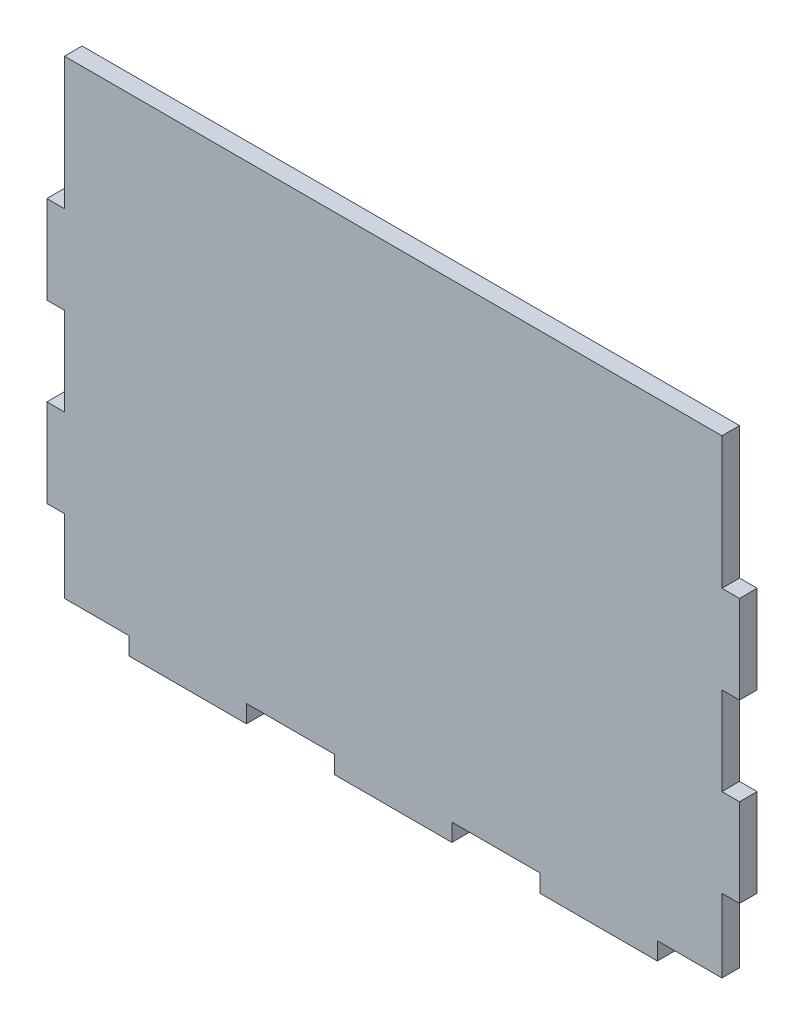
ISO-10303-21;
HEADER;
FILE_DESCRIPTION(('STEP AP214'),'2;1');
FILE_NAME('part.step','',(''),(''),'','','');
FILE_SCHEMA(('AUTOMOTIVE_DESIGN { 1 0 10303 214 1 1 1 1 }'));
ENDSEC;
DATA;
#1=APPLICATION_CONTEXT('core data for automotive mechanical design processes');
#2=APPLICATION_PROTOCOL_DEFINITION('international standard','automotive_design',2000,#1);
#3=PRODUCT_CONTEXT('',#1,'mechanical');
#4=PRODUCT('Part','Part','',(#3));
#5=PRODUCT_RELATED_PRODUCT_CATEGORY('part','',(#4));
#6=PRODUCT_DEFINITION_FORMATION('','',#4);
#7=PRODUCT_DEFINITION_CONTEXT('part definition',#1,'design');
#8=PRODUCT_DEFINITION('design','',#6,#7);
#9=PRODUCT_DEFINITION_SHAPE('','',#8);
#10=(LENGTH_UNIT() NAMED_UNIT(*) SI_UNIT(.MILLI.,.METRE.));
#11=(NAMED_UNIT(*) PLANE_ANGLE_UNIT() SI_UNIT($,.RADIAN.));
#12=(NAMED_UNIT(*) SI_UNIT($,.STERADIAN.) SOLID_ANGLE_UNIT());
#13=UNCERTAINTY_MEASURE_WITH_UNIT(LENGTH_MEASURE(1.E-05),#10,'distance_accuracy_value','');
#14=(GEOMETRIC_REPRESENTATION_CONTEXT(3) GLOBAL_UNCERTAINTY_ASSIGNED_CONTEXT((#13)) GLOBAL_UNIT_ASSIGNED_CONTEXT((#10,
#11,#12)) REPRESENTATION_CONTEXT('',''));
#15=CARTESIAN_POINT('',(0.,0.,0.));
#16=DIRECTION('',(0.,0.,1.));
#17=DIRECTION('',(1.,0.,0.));
#18=AXIS2_PLACEMENT_3D('',#15,#16,#17);
#19=CARTESIAN_POINT('',(-56.,0.,3.));
#20=DIRECTION('',(-1.,0.,0.));
#21=DIRECTION('',(0.,-1.,0.));
#22=AXIS2_PLACEMENT_3D('',#19,#20,#21);
#23=PLANE('',#22);
#24=DIRECTION('',(0.,0.,-1.));
#25=VECTOR('',#24,1.);
#26=CARTESIAN_POINT('',(-56.,-12.5,3.));
#27=LINE('',#26,#25);
#28=CARTESIAN_POINT('',(-56.,-12.5,3.));
#29=VERTEX_POINT('',#28);
#30=CARTESIAN_POINT('',(-56.,-12.5,0.));
#31=VERTEX_POINT('',#30);
#32=EDGE_CURVE('E12',#29,#31,#27,.T.);
#33=ORIENTED_EDGE('',*,*,#32,.F.);
#34=DIRECTION('',(0.,1.,0.));
#35=VECTOR('',#34,1.);
#36=CARTESIAN_POINT('',(-56.,0.,3.));
#37=LINE('',#36,#35);
#38=CARTESIAN_POINT('',(-56.,2.49999999999998,3.));
#39=VERTEX_POINT('',#38);
#40=EDGE_CURVE('E576',#29,#39,#37,.T.);
#41=ORIENTED_EDGE('',*,*,#40,.T.);
#42=DIRECTION('',(0.,0.,-1.));
#43=VECTOR('',#42,1.);
#44=CARTESIAN_POINT('',(-56.,2.49999999999998,3.));
#45=LINE('',#44,#43);
#46=CARTESIAN_POINT('',(-56.,2.49999999999998,0.));
#47=VERTEX_POINT('',#46);
#48=EDGE_CURVE('E636',#39,#47,#45,.T.);
#49=ORIENTED_EDGE('',*,*,#48,.T.);
#50=DIRECTION('',(0.,1.,0.));
#51=VECTOR('',#50,1.);
#52=CARTESIAN_POINT('',(-56.,0.,0.));
#53=LINE('',#52,#51);
#54=EDGE_CURVE('E529',#31,#47,#53,.T.);
#55=ORIENTED_EDGE('',*,*,#54,.F.);
#56=EDGE_LOOP('',(#33,#41,#49,#55));
#57=FACE_BOUND('',#56,.T.);
#58=ADVANCED_FACE('F323',(#57),#23,.T.);
#59=CARTESIAN_POINT('',(0.,0.,0.));
#60=DIRECTION('',(0.,0.,1.));
#61=DIRECTION('',(1.,0.,0.));
#62=AXIS2_PLACEMENT_3D('',#59,#60,#61);
#63=PLANE('',#62);
#64=DIRECTION('',(-1.,0.,0.));
#65=VECTOR('',#64,1.);
#66=CARTESIAN_POINT('',(0.,-40.,0.));
#67=LINE('',#66,#65);
#68=CARTESIAN_POINT('',(56.,-40.,0.));
#69=VERTEX_POINT('',#68);
#70=CARTESIAN_POINT('',(45.,-40.,0.));
#71=VERTEX_POINT('',#70);
#72=EDGE_CURVE('E534',#69,#71,#67,.T.);
#73=ORIENTED_EDGE('',*,*,#72,.T.);
#74=DIRECTION('',(0.,1.,0.));
#75=VECTOR('',#74,1.);
#76=CARTESIAN_POINT('',(45.,0.,0.));
#77=LINE('',#76,#75);
#78=CARTESIAN_POINT('',(45.,-43.,0.));
#79=VERTEX_POINT('',#78);
#80=EDGE_CURVE('E568',#79,#71,#77,.T.);
#81=ORIENTED_EDGE('',*,*,#80,.F.);
#82=DIRECTION('',(1.,0.,0.));
#83=VECTOR('',#82,1.);
#84=CARTESIAN_POINT('',(0.,-43.,0.));
#85=LINE('',#84,#83);
#86=CARTESIAN_POINT('',(25.,-43.,0.));
#87=VERTEX_POINT('',#86);
#88=EDGE_CURVE('E564',#87,#79,#85,.T.);
#89=ORIENTED_EDGE('',*,*,#88,.F.);
#90=DIRECTION('',(0.,1.,0.));
#91=VECTOR('',#90,1.);
#92=CARTESIAN_POINT('',(25.,0.,0.));
#93=LINE('',#92,#91);
#94=CARTESIAN_POINT('',(25.,-40.,0.));
#95=VERTEX_POINT('',#94);
#96=EDGE_CURVE('E560',#87,#95,#93,.T.);
#97=ORIENTED_EDGE('',*,*,#96,.T.);
#98=CARTESIAN_POINT('',(9.99999999999999,-40.,0.));
#99=VERTEX_POINT('',#98);
#100=EDGE_CURVE('E559',#95,#99,#67,.T.);
#101=ORIENTED_EDGE('',*,*,#100,.T.);
#102=DIRECTION('',(0.,1.,0.));
#103=VECTOR('',#102,1.);
#104=CARTESIAN_POINT('',(9.99999999999981,0.,0.));
#105=LINE('',#104,#103);
#106=CARTESIAN_POINT('',(10.,-43.,0.));
#107=VERTEX_POINT('',#106);
#108=EDGE_CURVE('E555',#107,#99,#105,.T.);
#109=ORIENTED_EDGE('',*,*,#108,.F.);
#110=DIRECTION('',(1.,0.,0.));
#111=VECTOR('',#110,1.);
#112=CARTESIAN_POINT('',(0.,-43.,0.));
#113=LINE('',#112,#111);
#114=CARTESIAN_POINT('',(-9.99999999999999,-43.,0.));
#115=VERTEX_POINT('',#114);
#116=EDGE_CURVE('E551',#115,#107,#113,.T.);
#117=ORIENTED_EDGE('',*,*,#116,.F.);
#118=DIRECTION('',(0.,1.,0.));
#119=VECTOR('',#118,1.);
#120=CARTESIAN_POINT('',(-9.99999999999999,0.,0.));
#121=LINE('',#120,#119);
#122=CARTESIAN_POINT('',(-9.99999999999999,-40.,0.));
#123=VERTEX_POINT('',#122);
#124=EDGE_CURVE('E547',#115,#123,#121,.T.);
#125=ORIENTED_EDGE('',*,*,#124,.T.);
#126=CARTESIAN_POINT('',(-25.,-40.,0.));
#127=VERTEX_POINT('',#126);
#128=EDGE_CURVE('E535',#123,#127,#67,.T.);
#129=ORIENTED_EDGE('',*,*,#128,.T.);
#130=DIRECTION('',(0.,1.,0.));
#131=VECTOR('',#130,1.);
#132=CARTESIAN_POINT('',(-25.,0.,0.));
#133=LINE('',#132,#131);
#134=CARTESIAN_POINT('',(-25.,-43.,0.));
#135=VERTEX_POINT('',#134);
#136=EDGE_CURVE('E543',#135,#127,#133,.T.);
#137=ORIENTED_EDGE('',*,*,#136,.F.);
#138=DIRECTION('',(-1.,0.,0.));
#139=VECTOR('',#138,1.);
#140=CARTESIAN_POINT('',(0.,-43.,0.));
#141=LINE('',#140,#139);
#142=CARTESIAN_POINT('',(-45.,-43.,0.));
#143=VERTEX_POINT('',#142);
#144=EDGE_CURVE('E539',#135,#143,#141,.T.);
#145=ORIENTED_EDGE('',*,*,#144,.T.);
#146=DIRECTION('',(0.,1.,0.));
#147=VECTOR('',#146,1.);
#148=CARTESIAN_POINT('',(-45.,0.,0.));
#149=LINE('',#148,#147);
#150=CARTESIAN_POINT('',(-45.,-40.,0.));
#151=VERTEX_POINT('',#150);
#152=EDGE_CURVE('E533',#143,#151,#149,.T.);
#153=ORIENTED_EDGE('',*,*,#152,.T.);
#154=CARTESIAN_POINT('',(-56.,-40.,0.));
#155=VERTEX_POINT('',#154);
#156=EDGE_CURVE('E528',#151,#155,#67,.T.);
#157=ORIENTED_EDGE('',*,*,#156,.T.);
#158=CARTESIAN_POINT('',(-56.,-27.5,0.));
#159=VERTEX_POINT('',#158);
#160=EDGE_CURVE('E524',#155,#159,#53,.T.);
#161=ORIENTED_EDGE('',*,*,#160,.T.);
#162=DIRECTION('',(1.,0.,0.));
#163=VECTOR('',#162,1.);
#164=CARTESIAN_POINT('',(-59.,-27.5,0.));
#165=LINE('',#164,#163);
#166=CARTESIAN_POINT('',(-59.,-27.5,0.));
#167=VERTEX_POINT('',#166);
#168=EDGE_CURVE('E678',#167,#159,#165,.T.);
#169=ORIENTED_EDGE('',*,*,#168,.F.);
#170=DIRECTION('',(0.,1.,0.));
#171=VECTOR('',#170,1.);
#172=CARTESIAN_POINT('',(-59.,-27.5,0.));
#173=LINE('',#172,#171);
#174=CARTESIAN_POINT('',(-59.,-12.5,0.));
#175=VERTEX_POINT('',#174);
#176=EDGE_CURVE('E483',#167,#175,#173,.T.);
#177=ORIENTED_EDGE('',*,*,#176,.T.);
#178=DIRECTION('',(1.,0.,0.));
#179=VECTOR('',#178,1.);
#180=CARTESIAN_POINT('',(-59.,-12.5,0.));
#181=LINE('',#180,#179);
#182=EDGE_CURVE('E690',#175,#31,#181,.T.);
#183=ORIENTED_EDGE('',*,*,#182,.T.);
#184=ORIENTED_EDGE('',*,*,#54,.T.);
#185=DIRECTION('',(1.,0.,0.));
#186=VECTOR('',#185,1.);
#187=CARTESIAN_POINT('',(-59.,2.5,0.));
#188=LINE('',#187,#186);
#189=CARTESIAN_POINT('',(-59.,2.5,0.));
#190=VERTEX_POINT('',#189);
#191=EDGE_CURVE('E465',#190,#47,#188,.T.);
#192=ORIENTED_EDGE('',*,*,#191,.F.);
#193=DIRECTION('',(0.,1.,0.));
#194=VECTOR('',#193,1.);
#195=CARTESIAN_POINT('',(-59.,2.5,0.));
#196=LINE('',#195,#194);
#197=CARTESIAN_POINT('',(-59.,17.5,0.));
#198=VERTEX_POINT('',#197);
#199=EDGE_CURVE('E456',#190,#198,#196,.T.);
#200=ORIENTED_EDGE('',*,*,#199,.T.);
#201=DIRECTION('',(1.,0.,0.));
#202=VECTOR('',#201,1.);
#203=CARTESIAN_POINT('',(-59.,17.5,0.));
#204=LINE('',#203,#202);
#205=CARTESIAN_POINT('',(-56.,17.5,0.));
#206=VERTEX_POINT('',#205);
#207=EDGE_CURVE('E459',#198,#206,#204,.T.);
#208=ORIENTED_EDGE('',*,*,#207,.T.);
#209=DIRECTION('',(0.,1.,0.));
#210=VECTOR('',#209,1.);
#211=CARTESIAN_POINT('',(-56.,-40.,0.));
#212=LINE('',#211,#210);
#213=CARTESIAN_POINT('',(-56.,40.,0.));
#214=VERTEX_POINT('',#213);
#215=EDGE_CURVE('E718',#206,#214,#212,.T.);
#216=ORIENTED_EDGE('',*,*,#215,.T.);
#217=DIRECTION('',(-1.,0.,0.));
#218=VECTOR('',#217,1.);
#219=CARTESIAN_POINT('',(56.,40.,0.));
#220=LINE('',#219,#218);
#221=CARTESIAN_POINT('',(56.,40.,0.));
#222=VERTEX_POINT('',#221);
#223=EDGE_CURVE('E478',#222,#214,#220,.T.);
#224=ORIENTED_EDGE('',*,*,#223,.F.);
#225=DIRECTION('',(0.,1.,0.));
#226=VECTOR('',#225,1.);
#227=CARTESIAN_POINT('',(56.,-40.,0.));
#228=LINE('',#227,#226);
#229=CARTESIAN_POINT('',(56.,17.5,0.));
#230=VERTEX_POINT('',#229);
#231=EDGE_CURVE('E448',#230,#222,#228,.T.);
#232=ORIENTED_EDGE('',*,*,#231,.F.);
#233=DIRECTION('',(-1.,0.,0.));
#234=VECTOR('',#233,1.);
#235=CARTESIAN_POINT('',(59.,17.5,0.));
#236=LINE('',#235,#234);
#237=CARTESIAN_POINT('',(59.,17.5,0.));
#238=VERTEX_POINT('',#237);
#239=EDGE_CURVE('E439',#238,#230,#236,.T.);
#240=ORIENTED_EDGE('',*,*,#239,.F.);
#241=DIRECTION('',(0.,1.,0.));
#242=VECTOR('',#241,1.);
#243=CARTESIAN_POINT('',(59.,2.5,0.));
#244=LINE('',#243,#242);
#245=CARTESIAN_POINT('',(59.,2.5,0.));
#246=VERTEX_POINT('',#245);
#247=EDGE_CURVE('E424',#246,#238,#244,.T.);
#248=ORIENTED_EDGE('',*,*,#247,.F.);
#249=DIRECTION('',(-1.,0.,0.));
#250=VECTOR('',#249,1.);
#251=CARTESIAN_POINT('',(59.,2.5,0.));
#252=LINE('',#251,#250);
#253=CARTESIAN_POINT('',(56.,2.49999999999999,0.));
#254=VERTEX_POINT('',#253);
#255=EDGE_CURVE('E435',#246,#254,#252,.T.);
#256=ORIENTED_EDGE('',*,*,#255,.T.);
#257=DIRECTION('',(0.,1.,0.));
#258=VECTOR('',#257,1.);
#259=CARTESIAN_POINT('',(56.,0.,0.));
#260=LINE('',#259,#258);
#261=CARTESIAN_POINT('',(56.,-12.5,0.));
#262=VERTEX_POINT('',#261);
#263=EDGE_CURVE('E577',#262,#254,#260,.T.);
#264=ORIENTED_EDGE('',*,*,#263,.F.);
#265=DIRECTION('',(-1.,0.,0.));
#266=VECTOR('',#265,1.);
#267=CARTESIAN_POINT('',(59.,-12.5,0.));
#268=LINE('',#267,#266);
#269=CARTESIAN_POINT('',(59.,-12.5,0.));
#270=VERTEX_POINT('',#269);
#271=EDGE_CURVE('E655',#270,#262,#268,.T.);
#272=ORIENTED_EDGE('',*,*,#271,.F.);
#273=DIRECTION('',(0.,1.,0.));
#274=VECTOR('',#273,1.);
#275=CARTESIAN_POINT('',(59.,-27.5,0.));
#276=LINE('',#275,#274);
#277=CARTESIAN_POINT('',(59.,-27.5,0.));
#278=VERTEX_POINT('',#277);
#279=EDGE_CURVE('E644',#278,#270,#276,.T.);
#280=ORIENTED_EDGE('',*,*,#279,.F.);
#281=DIRECTION('',(-1.,0.,0.));
#282=VECTOR('',#281,1.);
#283=CARTESIAN_POINT('',(59.,-27.5,0.));
#284=LINE('',#283,#282);
#285=CARTESIAN_POINT('',(56.,-27.5,0.));
#286=VERTEX_POINT('',#285);
#287=EDGE_CURVE('E651',#278,#286,#284,.T.);
#288=ORIENTED_EDGE('',*,*,#287,.T.);
#289=EDGE_CURVE('E572',#69,#286,#260,.T.);
#290=ORIENTED_EDGE('',*,*,#289,.F.);
#291=EDGE_LOOP('',(#73,#81,#89,#97,#101,#109,#117,#125,#129,#137,#145,#153,#157,#161,#169,#177,
#183,#184,#192,#200,#208,#216,#224,#232,#240,#248,#256,#264,#272,#280,#288,#290));
#292=FACE_BOUND('',#291,.T.);
#293=ADVANCED_FACE('F446',(#292),#63,.F.);
#294=CARTESIAN_POINT('',(0.,-40.,3.));
#295=DIRECTION('',(0.,-1.,0.));
#296=DIRECTION('',(0.,0.,-1.));
#297=AXIS2_PLACEMENT_3D('',#294,#295,#296);
#298=PLANE('',#297);
#299=ORIENTED_EDGE('',*,*,#156,.F.);
#300=DIRECTION('',(0.,0.,-1.));
#301=VECTOR('',#300,1.);
#302=CARTESIAN_POINT('',(-45.,-40.,3.));
#303=LINE('',#302,#301);
#304=CARTESIAN_POINT('',(-45.,-40.,3.));
#305=VERTEX_POINT('',#304);
#306=EDGE_CURVE('E628',#305,#151,#303,.T.);
#307=ORIENTED_EDGE('',*,*,#306,.F.);
#308=DIRECTION('',(-1.,0.,0.));
#309=VECTOR('',#308,1.);
#310=CARTESIAN_POINT('',(0.,-40.,3.));
#311=LINE('',#310,#309);
#312=CARTESIAN_POINT('',(-56.,-40.,3.));
#313=VERTEX_POINT('',#312);
#314=EDGE_CURVE('E520',#305,#313,#311,.T.);
#315=ORIENTED_EDGE('',*,*,#314,.T.);
#316=DIRECTION('',(0.,0.,-1.));
#317=VECTOR('',#316,1.);
#318=CARTESIAN_POINT('',(-56.,-40.,3.));
#319=LINE('',#318,#317);
#320=EDGE_CURVE('E632',#313,#155,#319,.T.);
#321=ORIENTED_EDGE('',*,*,#320,.T.);
#322=EDGE_LOOP('',(#299,#307,#315,#321));
#323=FACE_BOUND('',#322,.T.);
#324=ADVANCED_FACE('F840',(#323),#298,.T.);
#325=ORIENTED_EDGE('',*,*,#128,.F.);
#326=DIRECTION('',(0.,0.,-1.));
#327=VECTOR('',#326,1.);
#328=CARTESIAN_POINT('',(-9.99999999999999,-40.,3.));
#329=LINE('',#328,#327);
#330=CARTESIAN_POINT('',(-9.99999999999999,-40.,3.));
#331=VERTEX_POINT('',#330);
#332=EDGE_CURVE('E612',#331,#123,#329,.T.);
#333=ORIENTED_EDGE('',*,*,#332,.F.);
#334=CARTESIAN_POINT('',(-25.,-40.,3.));
#335=VERTEX_POINT('',#334);
#336=EDGE_CURVE('E763',#331,#335,#311,.T.);
#337=ORIENTED_EDGE('',*,*,#336,.T.);
#338=DIRECTION('',(0.,0.,-1.));
#339=VECTOR('',#338,1.);
#340=CARTESIAN_POINT('',(-25.,-40.,3.));
#341=LINE('',#340,#339);
#342=EDGE_CURVE('E616',#335,#127,#341,.T.);
#343=ORIENTED_EDGE('',*,*,#342,.T.);
#344=EDGE_LOOP('',(#325,#333,#337,#343));
#345=FACE_BOUND('',#344,.T.);
#346=ADVANCED_FACE('F846',(#345),#298,.T.);
#347=ORIENTED_EDGE('',*,*,#100,.F.);
#348=DIRECTION('',(0.,0.,-1.));
#349=VECTOR('',#348,1.);
#350=CARTESIAN_POINT('',(25.,-40.,3.));
#351=LINE('',#350,#349);
#352=CARTESIAN_POINT('',(25.,-40.,3.));
#353=VERTEX_POINT('',#352);
#354=EDGE_CURVE('E596',#353,#95,#351,.T.);
#355=ORIENTED_EDGE('',*,*,#354,.F.);
#356=CARTESIAN_POINT('',(9.99999999999999,-40.,3.));
#357=VERTEX_POINT('',#356);
#358=EDGE_CURVE('E519',#353,#357,#311,.T.);
#359=ORIENTED_EDGE('',*,*,#358,.T.);
#360=DIRECTION('',(0.,0.,-1.));
#361=VECTOR('',#360,1.);
#362=CARTESIAN_POINT('',(9.99999999999999,-40.,3.));
#363=LINE('',#362,#361);
#364=EDGE_CURVE('E600',#357,#99,#363,.T.);
#365=ORIENTED_EDGE('',*,*,#364,.T.);
#366=EDGE_LOOP('',(#347,#355,#359,#365));
#367=FACE_BOUND('',#366,.T.);
#368=ADVANCED_FACE('F859',(#367),#298,.T.);
#369=ORIENTED_EDGE('',*,*,#72,.F.);
#370=DIRECTION('',(0.,0.,-1.));
#371=VECTOR('',#370,1.);
#372=CARTESIAN_POINT('',(56.,-40.,3.));
#373=LINE('',#372,#371);
#374=CARTESIAN_POINT('',(56.,-40.,3.));
#375=VERTEX_POINT('',#374);
#376=EDGE_CURVE('E580',#375,#69,#373,.T.);
#377=ORIENTED_EDGE('',*,*,#376,.F.);
#378=CARTESIAN_POINT('',(45.,-40.,3.));
#379=VERTEX_POINT('',#378);
#380=EDGE_CURVE('E510',#375,#379,#311,.T.);
#381=ORIENTED_EDGE('',*,*,#380,.T.);
#382=DIRECTION('',(0.,0.,-1.));
#383=VECTOR('',#382,1.);
#384=CARTESIAN_POINT('',(45.,-40.,3.));
#385=LINE('',#384,#383);
#386=EDGE_CURVE('E584',#379,#71,#385,.T.);
#387=ORIENTED_EDGE('',*,*,#386,.T.);
#388=EDGE_LOOP('',(#369,#377,#381,#387));
#389=FACE_BOUND('',#388,.T.);
#390=ADVANCED_FACE('F808',(#389),#298,.T.);
#391=CARTESIAN_POINT('',(56.,0.,3.));
#392=DIRECTION('',(-1.,0.,0.));
#393=DIRECTION('',(0.,-1.,0.));
#394=AXIS2_PLACEMENT_3D('',#391,#392,#393);
#395=PLANE('',#394);
#396=DIRECTION('',(0.,1.,0.));
#397=VECTOR('',#396,1.);
#398=CARTESIAN_POINT('',(56.,0.,3.));
#399=LINE('',#398,#397);
#400=CARTESIAN_POINT('',(56.,-12.5,3.));
#401=VERTEX_POINT('',#400);
#402=CARTESIAN_POINT('',(56.,2.49999999999999,3.));
#403=VERTEX_POINT('',#402);
#404=EDGE_CURVE('E501',#401,#403,#399,.T.);
#405=ORIENTED_EDGE('',*,*,#404,.F.);
#406=DIRECTION('',(0.,0.,-1.));
#407=VECTOR('',#406,1.);
#408=CARTESIAN_POINT('',(56.,-12.5,3.));
#409=LINE('',#408,#407);
#410=EDGE_CURVE('E343',#401,#262,#409,.T.);
#411=ORIENTED_EDGE('',*,*,#410,.T.);
#412=ORIENTED_EDGE('',*,*,#263,.T.);
#413=DIRECTION('',(0.,0.,-1.));
#414=VECTOR('',#413,1.);
#415=CARTESIAN_POINT('',(56.,2.49999999999999,3.));
#416=LINE('',#415,#414);
#417=EDGE_CURVE('E515',#403,#254,#416,.T.);
#418=ORIENTED_EDGE('',*,*,#417,.F.);
#419=EDGE_LOOP('',(#405,#411,#412,#418));
#420=FACE_BOUND('',#419,.T.);
#421=ADVANCED_FACE('F836',(#420),#395,.F.);
#422=CARTESIAN_POINT('',(-56.,-27.5,3.));
#423=VERTEX_POINT('',#422);
#424=EDGE_CURVE('E755',#313,#423,#37,.T.);
#425=ORIENTED_EDGE('',*,*,#424,.T.);
#426=DIRECTION('',(0.,0.,-1.));
#427=VECTOR('',#426,1.);
#428=CARTESIAN_POINT('',(-56.,-27.5,3.));
#429=LINE('',#428,#427);
#430=EDGE_CURVE('E334',#423,#159,#429,.T.);
#431=ORIENTED_EDGE('',*,*,#430,.T.);
#432=ORIENTED_EDGE('',*,*,#160,.F.);
#433=ORIENTED_EDGE('',*,*,#320,.F.);
#434=EDGE_LOOP('',(#425,#431,#432,#433));
#435=FACE_BOUND('',#434,.T.);
#436=ADVANCED_FACE('F852',(#435),#23,.T.);
#437=DIRECTION('',(0.,0.,-1.));
#438=VECTOR('',#437,1.);
#439=CARTESIAN_POINT('',(56.,-27.5,3.));
#440=LINE('',#439,#438);
#441=CARTESIAN_POINT('',(56.,-27.5,3.));
#442=VERTEX_POINT('',#441);
#443=EDGE_CURVE('E669',#442,#286,#440,.T.);
#444=ORIENTED_EDGE('',*,*,#443,.F.);
#445=EDGE_CURVE('E509',#375,#442,#399,.T.);
#446=ORIENTED_EDGE('',*,*,#445,.F.);
#447=ORIENTED_EDGE('',*,*,#376,.T.);
#448=ORIENTED_EDGE('',*,*,#289,.T.);
#449=EDGE_LOOP('',(#444,#446,#447,#448));
#450=FACE_BOUND('',#449,.T.);
#451=ADVANCED_FACE('F815',(#450),#395,.F.);
#452=CARTESIAN_POINT('',(0.,0.,3.));
#453=DIRECTION('',(0.,0.,1.));
#454=DIRECTION('',(1.,0.,0.));
#455=AXIS2_PLACEMENT_3D('',#452,#453,#454);
#456=PLANE('',#455);
#457=ORIENTED_EDGE('',*,*,#358,.F.);
#458=DIRECTION('',(0.,1.,0.));
#459=VECTOR('',#458,1.);
#460=CARTESIAN_POINT('',(25.,0.,3.));
#461=LINE('',#460,#459);
#462=CARTESIAN_POINT('',(25.,-43.,3.));
#463=VERTEX_POINT('',#462);
#464=EDGE_CURVE('E787',#463,#353,#461,.T.);
#465=ORIENTED_EDGE('',*,*,#464,.F.);
#466=DIRECTION('',(1.,0.,0.));
#467=VECTOR('',#466,1.);
#468=CARTESIAN_POINT('',(0.,-43.,3.));
#469=LINE('',#468,#467);
#470=CARTESIAN_POINT('',(45.,-43.,3.));
#471=VERTEX_POINT('',#470);
#472=EDGE_CURVE('E790',#463,#471,#469,.T.);
#473=ORIENTED_EDGE('',*,*,#472,.T.);
#474=DIRECTION('',(0.,1.,0.));
#475=VECTOR('',#474,1.);
#476=CARTESIAN_POINT('',(45.,0.,3.));
#477=LINE('',#476,#475);
#478=EDGE_CURVE('E517',#471,#379,#477,.T.);
#479=ORIENTED_EDGE('',*,*,#478,.T.);
#480=ORIENTED_EDGE('',*,*,#380,.F.);
#481=ORIENTED_EDGE('',*,*,#445,.T.);
#482=DIRECTION('',(-1.,0.,0.));
#483=VECTOR('',#482,1.);
#484=CARTESIAN_POINT('',(59.,-27.5,3.));
#485=LINE('',#484,#483);
#486=CARTESIAN_POINT('',(59.,-27.5,3.));
#487=VERTEX_POINT('',#486);
#488=EDGE_CURVE('E640',#487,#442,#485,.T.);
#489=ORIENTED_EDGE('',*,*,#488,.F.);
#490=DIRECTION('',(0.,1.,0.));
#491=VECTOR('',#490,1.);
#492=CARTESIAN_POINT('',(59.,-27.5,3.));
#493=LINE('',#492,#491);
#494=CARTESIAN_POINT('',(59.,-12.5,3.));
#495=VERTEX_POINT('',#494);
#496=EDGE_CURVE('E647',#487,#495,#493,.T.);
#497=ORIENTED_EDGE('',*,*,#496,.T.);
#498=DIRECTION('',(-1.,0.,0.));
#499=VECTOR('',#498,1.);
#500=CARTESIAN_POINT('',(59.,-12.5,3.));
#501=LINE('',#500,#499);
#502=EDGE_CURVE('E502',#495,#401,#501,.T.);
#503=ORIENTED_EDGE('',*,*,#502,.T.);
#504=ORIENTED_EDGE('',*,*,#404,.T.);
#505=DIRECTION('',(-1.,0.,0.));
#506=VECTOR('',#505,1.);
#507=CARTESIAN_POINT('',(59.,2.5,3.));
#508=LINE('',#507,#506);
#509=CARTESIAN_POINT('',(59.,2.5,3.));
#510=VERTEX_POINT('',#509);
#511=EDGE_CURVE('E487',#510,#403,#508,.T.);
#512=ORIENTED_EDGE('',*,*,#511,.F.);
#513=DIRECTION('',(0.,1.,0.));
#514=VECTOR('',#513,1.);
#515=CARTESIAN_POINT('',(59.,2.5,3.));
#516=LINE('',#515,#514);
#517=CARTESIAN_POINT('',(59.,17.5,3.));
#518=VERTEX_POINT('',#517);
#519=EDGE_CURVE('E443',#510,#518,#516,.T.);
#520=ORIENTED_EDGE('',*,*,#519,.T.);
#521=DIRECTION('',(-1.,0.,0.));
#522=VECTOR('',#521,1.);
#523=CARTESIAN_POINT('',(59.,17.5,3.));
#524=LINE('',#523,#522);
#525=CARTESIAN_POINT('',(56.,17.5,3.));
#526=VERTEX_POINT('',#525);
#527=EDGE_CURVE('E434',#518,#526,#524,.T.);
#528=ORIENTED_EDGE('',*,*,#527,.T.);
#529=DIRECTION('',(0.,1.,0.));
#530=VECTOR('',#529,1.);
#531=CARTESIAN_POINT('',(56.,-40.,3.));
#532=LINE('',#531,#530);
#533=CARTESIAN_POINT('',(56.,40.,3.));
#534=VERTEX_POINT('',#533);
#535=EDGE_CURVE('E711',#526,#534,#532,.T.);
#536=ORIENTED_EDGE('',*,*,#535,.T.);
#537=DIRECTION('',(-1.,0.,0.));
#538=VECTOR('',#537,1.);
#539=CARTESIAN_POINT('',(56.,40.,3.));
#540=LINE('',#539,#538);
#541=CARTESIAN_POINT('',(-56.,40.,3.));
#542=VERTEX_POINT('',#541);
#543=EDGE_CURVE('E704',#534,#542,#540,.T.);
#544=ORIENTED_EDGE('',*,*,#543,.T.);
#545=DIRECTION('',(0.,1.,0.));
#546=VECTOR('',#545,1.);
#547=CARTESIAN_POINT('',(-56.,-40.,3.));
#548=LINE('',#547,#546);
#549=CARTESIAN_POINT('',(-56.,17.5,3.));
#550=VERTEX_POINT('',#549);
#551=EDGE_CURVE('E708',#550,#542,#548,.T.);
#552=ORIENTED_EDGE('',*,*,#551,.F.);
#553=DIRECTION('',(1.,0.,0.));
#554=VECTOR('',#553,1.);
#555=CARTESIAN_POINT('',(-59.,17.5,3.));
#556=LINE('',#555,#554);
#557=CARTESIAN_POINT('',(-59.,17.5,3.));
#558=VERTEX_POINT('',#557);
#559=EDGE_CURVE('E732',#558,#550,#556,.T.);
#560=ORIENTED_EDGE('',*,*,#559,.F.);
#561=DIRECTION('',(0.,1.,0.));
#562=VECTOR('',#561,1.);
#563=CARTESIAN_POINT('',(-59.,2.5,3.));
#564=LINE('',#563,#562);
#565=CARTESIAN_POINT('',(-59.,2.5,3.));
#566=VERTEX_POINT('',#565);
#567=EDGE_CURVE('E474',#566,#558,#564,.T.);
#568=ORIENTED_EDGE('',*,*,#567,.F.);
#569=DIRECTION('',(1.,0.,0.));
#570=VECTOR('',#569,1.);
#571=CARTESIAN_POINT('',(-59.,2.5,3.));
#572=LINE('',#571,#570);
#573=EDGE_CURVE('E468',#566,#39,#572,.T.);
#574=ORIENTED_EDGE('',*,*,#573,.T.);
#575=ORIENTED_EDGE('',*,*,#40,.F.);
#576=DIRECTION('',(1.,0.,0.));
#577=VECTOR('',#576,1.);
#578=CARTESIAN_POINT('',(-59.,-12.5,3.));
#579=LINE('',#578,#577);
#580=CARTESIAN_POINT('',(-59.,-12.5,3.));
#581=VERTEX_POINT('',#580);
#582=EDGE_CURVE('E677',#581,#29,#579,.T.);
#583=ORIENTED_EDGE('',*,*,#582,.F.);
#584=DIRECTION('',(0.,1.,0.));
#585=VECTOR('',#584,1.);
#586=CARTESIAN_POINT('',(-59.,-27.5,3.));
#587=LINE('',#586,#585);
#588=CARTESIAN_POINT('',(-59.,-27.5,3.));
#589=VERTEX_POINT('',#588);
#590=EDGE_CURVE('E673',#589,#581,#587,.T.);
#591=ORIENTED_EDGE('',*,*,#590,.F.);
#592=DIRECTION('',(1.,0.,0.));
#593=VECTOR('',#592,1.);
#594=CARTESIAN_POINT('',(-59.,-27.5,3.));
#595=LINE('',#594,#593);
#596=EDGE_CURVE('E682',#589,#423,#595,.T.);
#597=ORIENTED_EDGE('',*,*,#596,.T.);
#598=ORIENTED_EDGE('',*,*,#424,.F.);
#599=ORIENTED_EDGE('',*,*,#314,.F.);
#600=DIRECTION('',(0.,1.,0.));
#601=VECTOR('',#600,1.);
#602=CARTESIAN_POINT('',(-45.,0.,3.));
#603=LINE('',#602,#601);
#604=CARTESIAN_POINT('',(-45.,-43.,3.));
#605=VERTEX_POINT('',#604);
#606=EDGE_CURVE('E762',#605,#305,#603,.T.);
#607=ORIENTED_EDGE('',*,*,#606,.F.);
#608=DIRECTION('',(-1.,0.,0.));
#609=VECTOR('',#608,1.);
#610=CARTESIAN_POINT('',(0.,-43.,3.));
#611=LINE('',#610,#609);
#612=CARTESIAN_POINT('',(-25.,-43.,3.));
#613=VERTEX_POINT('',#612);
#614=EDGE_CURVE('E767',#613,#605,#611,.T.);
#615=ORIENTED_EDGE('',*,*,#614,.F.);
#616=DIRECTION('',(0.,1.,0.));
#617=VECTOR('',#616,1.);
#618=CARTESIAN_POINT('',(-25.,0.,3.));
#619=LINE('',#618,#617);
#620=EDGE_CURVE('E771',#613,#335,#619,.T.);
#621=ORIENTED_EDGE('',*,*,#620,.T.);
#622=ORIENTED_EDGE('',*,*,#336,.F.);
#623=DIRECTION('',(0.,1.,0.));
#624=VECTOR('',#623,1.);
#625=CARTESIAN_POINT('',(-9.99999999999999,0.,3.));
#626=LINE('',#625,#624);
#627=CARTESIAN_POINT('',(-9.99999999999999,-43.,3.));
#628=VERTEX_POINT('',#627);
#629=EDGE_CURVE('E775',#628,#331,#626,.T.);
#630=ORIENTED_EDGE('',*,*,#629,.F.);
#631=DIRECTION('',(1.,0.,0.));
#632=VECTOR('',#631,1.);
#633=CARTESIAN_POINT('',(0.,-43.,3.));
#634=LINE('',#633,#632);
#635=CARTESIAN_POINT('',(10.,-43.,3.));
#636=VERTEX_POINT('',#635);
#637=EDGE_CURVE('E779',#628,#636,#634,.T.);
#638=ORIENTED_EDGE('',*,*,#637,.T.);
#639=DIRECTION('',(0.,1.,0.));
#640=VECTOR('',#639,1.);
#641=CARTESIAN_POINT('',(9.99999999999981,0.,3.));
#642=LINE('',#641,#640);
#643=EDGE_CURVE('E783',#636,#357,#642,.T.);
#644=ORIENTED_EDGE('',*,*,#643,.T.);
#645=EDGE_LOOP('',(#457,#465,#473,#479,#480,#481,#489,#497,#503,#504,#512,#520,#528,#536,#544,
#552,#560,#568,#574,#575,#583,#591,#597,#598,#599,#607,#615,#621,#622,#630,#638,#644));
#646=FACE_BOUND('',#645,.T.);
#647=ADVANCED_FACE('F498',(#646),#456,.T.);
#648=CARTESIAN_POINT('',(-59.,-27.5,3.));
#649=DIRECTION('',(0.,1.,0.));
#650=DIRECTION('',(0.,0.,1.));
#651=AXIS2_PLACEMENT_3D('',#648,#649,#650);
#652=PLANE('',#651);
#653=ORIENTED_EDGE('',*,*,#168,.T.);
#654=ORIENTED_EDGE('',*,*,#430,.F.);
#655=ORIENTED_EDGE('',*,*,#596,.F.);
#656=DIRECTION('',(0.,0.,-1.));
#657=VECTOR('',#656,1.);
#658=CARTESIAN_POINT('',(-59.,-27.5,3.));
#659=LINE('',#658,#657);
#660=EDGE_CURVE('E656',#589,#167,#659,.T.);
#661=ORIENTED_EDGE('',*,*,#660,.T.);
#662=EDGE_LOOP('',(#653,#654,#655,#661));
#663=FACE_BOUND('',#662,.T.);
#664=ADVANCED_FACE('F853',(#663),#652,.F.);
#665=CARTESIAN_POINT('',(-59.,-12.5,3.));
#666=DIRECTION('',(0.,1.,0.));
#667=DIRECTION('',(-1.,0.,0.));
#668=AXIS2_PLACEMENT_3D('',#665,#666,#667);
#669=PLANE('',#668);
#670=ORIENTED_EDGE('',*,*,#182,.F.);
#671=DIRECTION('',(0.,0.,-1.));
#672=VECTOR('',#671,1.);
#673=CARTESIAN_POINT('',(-59.,-12.5,3.));
#674=LINE('',#673,#672);
#675=EDGE_CURVE('E686',#581,#175,#674,.T.);
#676=ORIENTED_EDGE('',*,*,#675,.F.);
#677=ORIENTED_EDGE('',*,*,#582,.T.);
#678=ORIENTED_EDGE('',*,*,#32,.T.);
#679=EDGE_LOOP('',(#670,#676,#677,#678));
#680=FACE_BOUND('',#679,.T.);
#681=ADVANCED_FACE('F895',(#680),#669,.T.);
#682=CARTESIAN_POINT('',(-59.,-27.5,3.));
#683=DIRECTION('',(-1.,0.,0.));
#684=DIRECTION('',(0.,0.,1.));
#685=AXIS2_PLACEMENT_3D('',#682,#683,#684);
#686=PLANE('',#685);
#687=ORIENTED_EDGE('',*,*,#176,.F.);
#688=ORIENTED_EDGE('',*,*,#660,.F.);
#689=ORIENTED_EDGE('',*,*,#590,.T.);
#690=ORIENTED_EDGE('',*,*,#675,.T.);
#691=EDGE_LOOP('',(#687,#688,#689,#690));
#692=FACE_BOUND('',#691,.T.);
#693=ADVANCED_FACE('F850',(#692),#686,.T.);
#694=CARTESIAN_POINT('',(-45.,0.,3.));
#695=DIRECTION('',(-1.,0.,0.));
#696=DIRECTION('',(0.,0.,1.));
#697=AXIS2_PLACEMENT_3D('',#694,#695,#696);
#698=PLANE('',#697);
#699=ORIENTED_EDGE('',*,*,#152,.F.);
#700=DIRECTION('',(0.,0.,-1.));
#701=VECTOR('',#700,1.);
#702=CARTESIAN_POINT('',(-45.,-43.,3.));
#703=LINE('',#702,#701);
#704=EDGE_CURVE('E624',#605,#143,#703,.T.);
#705=ORIENTED_EDGE('',*,*,#704,.F.);
#706=ORIENTED_EDGE('',*,*,#606,.T.);
#707=ORIENTED_EDGE('',*,*,#306,.T.);
#708=EDGE_LOOP('',(#699,#705,#706,#707));
#709=FACE_BOUND('',#708,.T.);
#710=ADVANCED_FACE('F849',(#709),#698,.T.);
#711=CARTESIAN_POINT('',(0.,-43.,3.));
#712=DIRECTION('',(0.,-1.,0.));
#713=DIRECTION('',(0.,0.,-1.));
#714=AXIS2_PLACEMENT_3D('',#711,#712,#713);
#715=PLANE('',#714);
#716=ORIENTED_EDGE('',*,*,#144,.F.);
#717=DIRECTION('',(0.,0.,-1.));
#718=VECTOR('',#717,1.);
#719=CARTESIAN_POINT('',(-25.,-43.,3.));
#720=LINE('',#719,#718);
#721=EDGE_CURVE('E620',#613,#135,#720,.T.);
#722=ORIENTED_EDGE('',*,*,#721,.F.);
#723=ORIENTED_EDGE('',*,*,#614,.T.);
#724=ORIENTED_EDGE('',*,*,#704,.T.);
#725=EDGE_LOOP('',(#716,#722,#723,#724));
#726=FACE_BOUND('',#725,.T.);
#727=ADVANCED_FACE('F885',(#726),#715,.T.);
#728=CARTESIAN_POINT('',(-25.,0.,3.));
#729=DIRECTION('',(-1.,0.,0.));
#730=DIRECTION('',(0.,0.,1.));
#731=AXIS2_PLACEMENT_3D('',#728,#729,#730);
#732=PLANE('',#731);
#733=ORIENTED_EDGE('',*,*,#136,.T.);
#734=ORIENTED_EDGE('',*,*,#342,.F.);
#735=ORIENTED_EDGE('',*,*,#620,.F.);
#736=ORIENTED_EDGE('',*,*,#721,.T.);
#737=EDGE_LOOP('',(#733,#734,#735,#736));
#738=FACE_BOUND('',#737,.T.);
#739=ADVANCED_FACE('F881',(#738),#732,.F.);
#740=CARTESIAN_POINT('',(-9.99999999999999,0.,3.));
#741=DIRECTION('',(-1.,0.,0.));
#742=DIRECTION('',(0.,0.,1.));
#743=AXIS2_PLACEMENT_3D('',#740,#741,#742);
#744=PLANE('',#743);
#745=ORIENTED_EDGE('',*,*,#124,.F.);
#746=DIRECTION('',(0.,0.,-1.));
#747=VECTOR('',#746,1.);
#748=CARTESIAN_POINT('',(-9.99999999999999,-43.,3.));
#749=LINE('',#748,#747);
#750=EDGE_CURVE('E608',#628,#115,#749,.T.);
#751=ORIENTED_EDGE('',*,*,#750,.F.);
#752=ORIENTED_EDGE('',*,*,#629,.T.);
#753=ORIENTED_EDGE('',*,*,#332,.T.);
#754=EDGE_LOOP('',(#745,#751,#752,#753));
#755=FACE_BOUND('',#754,.T.);
#756=ADVANCED_FACE('F877',(#755),#744,.T.);
#757=CARTESIAN_POINT('',(0.,-43.,3.));
#758=DIRECTION('',(0.,1.,0.));
#759=DIRECTION('',(0.,0.,1.));
#760=AXIS2_PLACEMENT_3D('',#757,#758,#759);
#761=PLANE('',#760);
#762=ORIENTED_EDGE('',*,*,#116,.T.);
#763=DIRECTION('',(0.,0.,-1.));
#764=VECTOR('',#763,1.);
#765=CARTESIAN_POINT('',(10.,-43.,3.));
#766=LINE('',#765,#764);
#767=EDGE_CURVE('E604',#636,#107,#766,.T.);
#768=ORIENTED_EDGE('',*,*,#767,.F.);
#769=ORIENTED_EDGE('',*,*,#637,.F.);
#770=ORIENTED_EDGE('',*,*,#750,.T.);
#771=EDGE_LOOP('',(#762,#768,#769,#770));
#772=FACE_BOUND('',#771,.T.);
#773=ADVANCED_FACE('F873',(#772),#761,.F.);
#774=CARTESIAN_POINT('',(9.99999999999981,0.,3.));
#775=DIRECTION('',(-1.,0.,0.));
#776=DIRECTION('',(0.,-1.,0.));
#777=AXIS2_PLACEMENT_3D('',#774,#775,#776);
#778=PLANE('',#777);
#779=ORIENTED_EDGE('',*,*,#108,.T.);
#780=ORIENTED_EDGE('',*,*,#364,.F.);
#781=ORIENTED_EDGE('',*,*,#643,.F.);
#782=ORIENTED_EDGE('',*,*,#767,.T.);
#783=EDGE_LOOP('',(#779,#780,#781,#782));
#784=FACE_BOUND('',#783,.T.);
#785=ADVANCED_FACE('F869',(#784),#778,.F.);
#786=CARTESIAN_POINT('',(25.,0.,3.));
#787=DIRECTION('',(-1.,0.,0.));
#788=DIRECTION('',(0.,0.,1.));
#789=AXIS2_PLACEMENT_3D('',#786,#787,#788);
#790=PLANE('',#789);
#791=ORIENTED_EDGE('',*,*,#96,.F.);
#792=DIRECTION('',(0.,0.,-1.));
#793=VECTOR('',#792,1.);
#794=CARTESIAN_POINT('',(25.,-43.,3.));
#795=LINE('',#794,#793);
#796=EDGE_CURVE('E592',#463,#87,#795,.T.);
#797=ORIENTED_EDGE('',*,*,#796,.F.);
#798=ORIENTED_EDGE('',*,*,#464,.T.);
#799=ORIENTED_EDGE('',*,*,#354,.T.);
#800=EDGE_LOOP('',(#791,#797,#798,#799));
#801=FACE_BOUND('',#800,.T.);
#802=ADVANCED_FACE('F865',(#801),#790,.T.);
#803=CARTESIAN_POINT('',(0.,-43.,3.));
#804=DIRECTION('',(0.,1.,0.));
#805=DIRECTION('',(0.,0.,1.));
#806=AXIS2_PLACEMENT_3D('',#803,#804,#805);
#807=PLANE('',#806);
#808=ORIENTED_EDGE('',*,*,#88,.T.);
#809=DIRECTION('',(0.,0.,-1.));
#810=VECTOR('',#809,1.);
#811=CARTESIAN_POINT('',(45.,-43.,3.));
#812=LINE('',#811,#810);
#813=EDGE_CURVE('E588',#471,#79,#812,.T.);
#814=ORIENTED_EDGE('',*,*,#813,.F.);
#815=ORIENTED_EDGE('',*,*,#472,.F.);
#816=ORIENTED_EDGE('',*,*,#796,.T.);
#817=EDGE_LOOP('',(#808,#814,#815,#816));
#818=FACE_BOUND('',#817,.T.);
#819=ADVANCED_FACE('F862',(#818),#807,.F.);
#820=CARTESIAN_POINT('',(45.,0.,3.));
#821=DIRECTION('',(-1.,0.,0.));
#822=DIRECTION('',(0.,0.,1.));
#823=AXIS2_PLACEMENT_3D('',#820,#821,#822);
#824=PLANE('',#823);
#825=ORIENTED_EDGE('',*,*,#80,.T.);
#826=ORIENTED_EDGE('',*,*,#386,.F.);
#827=ORIENTED_EDGE('',*,*,#478,.F.);
#828=ORIENTED_EDGE('',*,*,#813,.T.);
#829=EDGE_LOOP('',(#825,#826,#827,#828));
#830=FACE_BOUND('',#829,.T.);
#831=ADVANCED_FACE('F837',(#830),#824,.F.);
#832=CARTESIAN_POINT('',(59.,-27.5,3.));
#833=DIRECTION('',(-1.,0.,0.));
#834=DIRECTION('',(0.,0.,1.));
#835=AXIS2_PLACEMENT_3D('',#832,#833,#834);
#836=PLANE('',#835);
#837=ORIENTED_EDGE('',*,*,#279,.T.);
#838=DIRECTION('',(0.,0.,-1.));
#839=VECTOR('',#838,1.);
#840=CARTESIAN_POINT('',(59.,-12.5,3.));
#841=LINE('',#840,#839);
#842=EDGE_CURVE('E650',#495,#270,#841,.T.);
#843=ORIENTED_EDGE('',*,*,#842,.F.);
#844=ORIENTED_EDGE('',*,*,#496,.F.);
#845=DIRECTION('',(0.,0.,-1.));
#846=VECTOR('',#845,1.);
#847=CARTESIAN_POINT('',(59.,-27.5,3.));
#848=LINE('',#847,#846);
#849=EDGE_CURVE('E661',#487,#278,#848,.T.);
#850=ORIENTED_EDGE('',*,*,#849,.T.);
#851=EDGE_LOOP('',(#837,#843,#844,#850));
#852=FACE_BOUND('',#851,.T.);
#853=ADVANCED_FACE('F824',(#852),#836,.F.);
#854=CARTESIAN_POINT('',(59.,-12.5,3.));
#855=DIRECTION('',(0.,-1.,0.));
#856=DIRECTION('',(1.,0.,0.));
#857=AXIS2_PLACEMENT_3D('',#854,#855,#856);
#858=PLANE('',#857);
#859=ORIENTED_EDGE('',*,*,#271,.T.);
#860=ORIENTED_EDGE('',*,*,#410,.F.);
#861=ORIENTED_EDGE('',*,*,#502,.F.);
#862=ORIENTED_EDGE('',*,*,#842,.T.);
#863=EDGE_LOOP('',(#859,#860,#861,#862));
#864=FACE_BOUND('',#863,.T.);
#865=ADVANCED_FACE('F826',(#864),#858,.F.);
#866=CARTESIAN_POINT('',(59.,-27.5,3.));
#867=DIRECTION('',(0.,-1.,0.));
#868=DIRECTION('',(0.,0.,-1.));
#869=AXIS2_PLACEMENT_3D('',#866,#867,#868);
#870=PLANE('',#869);
#871=ORIENTED_EDGE('',*,*,#287,.F.);
#872=ORIENTED_EDGE('',*,*,#849,.F.);
#873=ORIENTED_EDGE('',*,*,#488,.T.);
#874=ORIENTED_EDGE('',*,*,#443,.T.);
#875=EDGE_LOOP('',(#871,#872,#873,#874));
#876=FACE_BOUND('',#875,.T.);
#877=ADVANCED_FACE('F821',(#876),#870,.T.);
#878=CARTESIAN_POINT('',(59.,17.5,3.));
#879=DIRECTION('',(0.,-1.,0.));
#880=DIRECTION('',(0.,0.,-1.));
#881=AXIS2_PLACEMENT_3D('',#878,#879,#880);
#882=PLANE('',#881);
#883=ORIENTED_EDGE('',*,*,#239,.T.);
#884=DIRECTION('',(0.,0.,-1.));
#885=VECTOR('',#884,1.);
#886=CARTESIAN_POINT('',(56.,17.5,3.));
#887=LINE('',#886,#885);
#888=EDGE_CURVE('E327',#526,#230,#887,.T.);
#889=ORIENTED_EDGE('',*,*,#888,.F.);
#890=ORIENTED_EDGE('',*,*,#527,.F.);
#891=DIRECTION('',(0.,0.,-1.));
#892=VECTOR('',#891,1.);
#893=CARTESIAN_POINT('',(59.,17.5,3.));
#894=LINE('',#893,#892);
#895=EDGE_CURVE('E427',#518,#238,#894,.T.);
#896=ORIENTED_EDGE('',*,*,#895,.T.);
#897=EDGE_LOOP('',(#883,#889,#890,#896));
#898=FACE_BOUND('',#897,.T.);
#899=ADVANCED_FACE('F325',(#898),#882,.F.);
#900=CARTESIAN_POINT('',(-59.,17.5,3.));
#901=DIRECTION('',(0.,1.,0.));
#902=DIRECTION('',(0.,0.,1.));
#903=AXIS2_PLACEMENT_3D('',#900,#901,#902);
#904=PLANE('',#903);
#905=ORIENTED_EDGE('',*,*,#207,.F.);
#906=DIRECTION('',(0.,0.,-1.));
#907=VECTOR('',#906,1.);
#908=CARTESIAN_POINT('',(-59.,17.5,3.));
#909=LINE('',#908,#907);
#910=EDGE_CURVE('E479',#558,#198,#909,.T.);
#911=ORIENTED_EDGE('',*,*,#910,.F.);
#912=ORIENTED_EDGE('',*,*,#559,.T.);
#913=DIRECTION('',(0.,0.,-1.));
#914=VECTOR('',#913,1.);
#915=CARTESIAN_POINT('',(-56.,17.5,3.));
#916=LINE('',#915,#914);
#917=EDGE_CURVE('E480',#550,#206,#916,.T.);
#918=ORIENTED_EDGE('',*,*,#917,.T.);
#919=EDGE_LOOP('',(#905,#911,#912,#918));
#920=FACE_BOUND('',#919,.T.);
#921=ADVANCED_FACE('F1022',(#920),#904,.T.);
#922=CARTESIAN_POINT('',(-59.,2.5,3.));
#923=DIRECTION('',(-1.,0.,0.));
#924=DIRECTION('',(0.,-1.,0.));
#925=AXIS2_PLACEMENT_3D('',#922,#923,#924);
#926=PLANE('',#925);
#927=ORIENTED_EDGE('',*,*,#199,.F.);
#928=DIRECTION('',(0.,0.,-1.));
#929=VECTOR('',#928,1.);
#930=CARTESIAN_POINT('',(-59.,2.5,3.));
#931=LINE('',#930,#929);
#932=EDGE_CURVE('E475',#566,#190,#931,.T.);
#933=ORIENTED_EDGE('',*,*,#932,.F.);
#934=ORIENTED_EDGE('',*,*,#567,.T.);
#935=ORIENTED_EDGE('',*,*,#910,.T.);
#936=EDGE_LOOP('',(#927,#933,#934,#935));
#937=FACE_BOUND('',#936,.T.);
#938=ADVANCED_FACE('F1024',(#937),#926,.T.);
#939=CARTESIAN_POINT('',(59.,2.5,3.));
#940=DIRECTION('',(-1.,0.,0.));
#941=DIRECTION('',(0.,-1.,0.));
#942=AXIS2_PLACEMENT_3D('',#939,#940,#941);
#943=PLANE('',#942);
#944=ORIENTED_EDGE('',*,*,#247,.T.);
#945=ORIENTED_EDGE('',*,*,#895,.F.);
#946=ORIENTED_EDGE('',*,*,#519,.F.);
#947=DIRECTION('',(0.,0.,-1.));
#948=VECTOR('',#947,1.);
#949=CARTESIAN_POINT('',(59.,2.5,3.));
#950=LINE('',#949,#948);
#951=EDGE_CURVE('E421',#510,#246,#950,.T.);
#952=ORIENTED_EDGE('',*,*,#951,.T.);
#953=EDGE_LOOP('',(#944,#945,#946,#952));
#954=FACE_BOUND('',#953,.T.);
#955=ADVANCED_FACE('F426',(#954),#943,.F.);
#956=CARTESIAN_POINT('',(56.,-40.,3.));
#957=DIRECTION('',(-1.,0.,0.));
#958=DIRECTION('',(0.,-1.,0.));
#959=AXIS2_PLACEMENT_3D('',#956,#957,#958);
#960=PLANE('',#959);
#961=ORIENTED_EDGE('',*,*,#535,.F.);
#962=ORIENTED_EDGE('',*,*,#888,.T.);
#963=ORIENTED_EDGE('',*,*,#231,.T.);
#964=DIRECTION('',(0.,0.,-1.));
#965=VECTOR('',#964,1.);
#966=CARTESIAN_POINT('',(56.,40.,3.));
#967=LINE('',#966,#965);
#968=EDGE_CURVE('E714',#534,#222,#967,.T.);
#969=ORIENTED_EDGE('',*,*,#968,.F.);
#970=EDGE_LOOP('',(#961,#962,#963,#969));
#971=FACE_BOUND('',#970,.T.);
#972=ADVANCED_FACE('F1012',(#971),#960,.F.);
#973=CARTESIAN_POINT('',(56.,40.,3.));
#974=DIRECTION('',(0.,-1.,0.));
#975=DIRECTION('',(0.,0.,-1.));
#976=AXIS2_PLACEMENT_3D('',#973,#974,#975);
#977=PLANE('',#976);
#978=ORIENTED_EDGE('',*,*,#223,.T.);
#979=DIRECTION('',(0.,0.,-1.));
#980=VECTOR('',#979,1.);
#981=CARTESIAN_POINT('',(-56.,40.,3.));
#982=LINE('',#981,#980);
#983=EDGE_CURVE('E726',#542,#214,#982,.T.);
#984=ORIENTED_EDGE('',*,*,#983,.F.);
#985=ORIENTED_EDGE('',*,*,#543,.F.);
#986=ORIENTED_EDGE('',*,*,#968,.T.);
#987=EDGE_LOOP('',(#978,#984,#985,#986));
#988=FACE_BOUND('',#987,.T.);
#989=ADVANCED_FACE('F1017',(#988),#977,.F.);
#990=CARTESIAN_POINT('',(-56.,-40.,3.));
#991=DIRECTION('',(-1.,0.,0.));
#992=DIRECTION('',(0.,-1.,0.));
#993=AXIS2_PLACEMENT_3D('',#990,#991,#992);
#994=PLANE('',#993);
#995=ORIENTED_EDGE('',*,*,#917,.F.);
#996=ORIENTED_EDGE('',*,*,#551,.T.);
#997=ORIENTED_EDGE('',*,*,#983,.T.);
#998=ORIENTED_EDGE('',*,*,#215,.F.);
#999=EDGE_LOOP('',(#995,#996,#997,#998));
#1000=FACE_BOUND('',#999,.T.);
#1001=ADVANCED_FACE('F1020',(#1000),#994,.T.);
#1002=CARTESIAN_POINT('',(59.,2.5,3.));
#1003=DIRECTION('',(0.,-1.,0.));
#1004=DIRECTION('',(1.,0.,0.));
#1005=AXIS2_PLACEMENT_3D('',#1002,#1003,#1004);
#1006=PLANE('',#1005);
#1007=ORIENTED_EDGE('',*,*,#255,.F.);
#1008=ORIENTED_EDGE('',*,*,#951,.F.);
#1009=ORIENTED_EDGE('',*,*,#511,.T.);
#1010=ORIENTED_EDGE('',*,*,#417,.T.);
#1011=EDGE_LOOP('',(#1007,#1008,#1009,#1010));
#1012=FACE_BOUND('',#1011,.T.);
#1013=ADVANCED_FACE('F1040',(#1012),#1006,.T.);
#1014=CARTESIAN_POINT('',(-59.,2.5,3.));
#1015=DIRECTION('',(0.,1.,0.));
#1016=DIRECTION('',(-1.,0.,0.));
#1017=AXIS2_PLACEMENT_3D('',#1014,#1015,#1016);
#1018=PLANE('',#1017);
#1019=ORIENTED_EDGE('',*,*,#191,.T.);
#1020=ORIENTED_EDGE('',*,*,#48,.F.);
#1021=ORIENTED_EDGE('',*,*,#573,.F.);
#1022=ORIENTED_EDGE('',*,*,#932,.T.);
#1023=EDGE_LOOP('',(#1019,#1020,#1021,#1022));
#1024=FACE_BOUND('',#1023,.T.);
#1025=ADVANCED_FACE('F1025',(#1024),#1018,.F.);
#1026=CLOSED_SHELL('',(#58,#293,#324,#346,#368,#390,#421,#436,#451,#647,#664,#681,#693,#710,
#727,#739,#756,#773,#785,#802,#819,#831,#853,#865,#877,#899,#921,#938,#955,#972,#989,#1001,
#1013,#1025));
#1027=MANIFOLD_SOLID_BREP('B2',#1026);
#1028=ADVANCED_BREP_SHAPE_REPRESENTATION('',(#18,#1027),#14);
#1029=SHAPE_DEFINITION_REPRESENTATION(#9,#1028);
ENDSEC;
END-ISO-10303-21;
